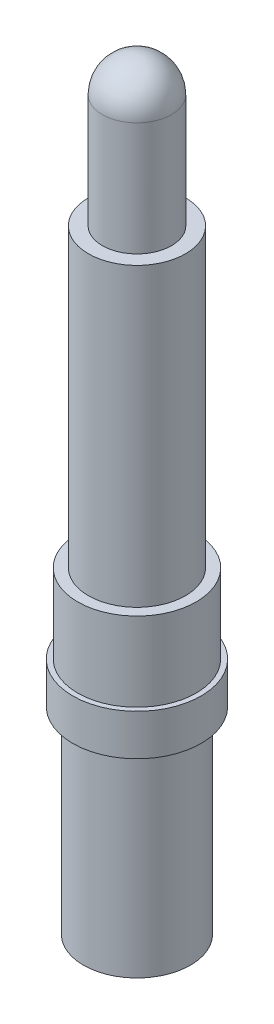
ISO-10303-21;
HEADER;
FILE_DESCRIPTION(('STEP AP214'),'2;1');
FILE_NAME('part.step','',(''),(''),'','','');
FILE_SCHEMA(('AUTOMOTIVE_DESIGN { 1 0 10303 214 1 1 1 1 }'));
ENDSEC;
DATA;
#1=APPLICATION_CONTEXT('core data for automotive mechanical design processes');
#2=APPLICATION_PROTOCOL_DEFINITION('international standard','automotive_design',2000,#1);
#3=PRODUCT_CONTEXT('',#1,'mechanical');
#4=PRODUCT('Part','Part','',(#3));
#5=PRODUCT_RELATED_PRODUCT_CATEGORY('part','',(#4));
#6=PRODUCT_DEFINITION_FORMATION('','',#4);
#7=PRODUCT_DEFINITION_CONTEXT('part definition',#1,'design');
#8=PRODUCT_DEFINITION('design','',#6,#7);
#9=PRODUCT_DEFINITION_SHAPE('','',#8);
#10=(LENGTH_UNIT() NAMED_UNIT(*) SI_UNIT(.MILLI.,.METRE.));
#11=(NAMED_UNIT(*) PLANE_ANGLE_UNIT() SI_UNIT($,.RADIAN.));
#12=(NAMED_UNIT(*) SI_UNIT($,.STERADIAN.) SOLID_ANGLE_UNIT());
#13=UNCERTAINTY_MEASURE_WITH_UNIT(LENGTH_MEASURE(1.E-05),#10,'distance_accuracy_value','');
#14=(GEOMETRIC_REPRESENTATION_CONTEXT(3) GLOBAL_UNCERTAINTY_ASSIGNED_CONTEXT((#13)) GLOBAL_UNIT_ASSIGNED_CONTEXT((#10,
#11,#12)) REPRESENTATION_CONTEXT('',''));
#15=CARTESIAN_POINT('',(0.,0.,0.));
#16=DIRECTION('',(0.,0.,1.));
#17=DIRECTION('',(1.,0.,0.));
#18=AXIS2_PLACEMENT_3D('',#15,#16,#17);
#19=CARTESIAN_POINT('',(0.,11.2268,0.));
#20=DIRECTION('',(0.,1.,0.));
#21=DIRECTION('',(1.,0.,0.));
#22=AXIS2_PLACEMENT_3D('',#19,#20,#21);
#23=SPHERICAL_SURFACE('',#22,0.533399999999996);
#24=CARTESIAN_POINT('',(0.,11.2268,0.));
#25=DIRECTION('',(0.,1.,0.));
#26=DIRECTION('',(0.,0.,1.));
#27=AXIS2_PLACEMENT_3D('',#24,#25,#26);
#28=CIRCLE('',#27,0.5334);
#29=CARTESIAN_POINT('',(0.,11.2268,0.5334));
#30=VERTEX_POINT('',#29);
#31=EDGE_CURVE('E10',#30,#30,#28,.T.);
#32=ORIENTED_EDGE('',*,*,#31,.T.);
#33=EDGE_LOOP('',(#32));
#34=FACE_BOUND('',#33,.T.);
#35=ADVANCED_FACE('F32',(#34),#23,.T.);
#36=CARTESIAN_POINT('',(0.,0.,0.));
#37=DIRECTION('',(0.,1.,0.));
#38=DIRECTION('',(0.,0.,1.));
#39=AXIS2_PLACEMENT_3D('',#36,#37,#38);
#40=CYLINDRICAL_SURFACE('',#39,0.5334);
#41=ORIENTED_EDGE('',*,*,#31,.F.);
#42=EDGE_LOOP('',(#41));
#43=FACE_BOUND('',#42,.T.);
#44=CARTESIAN_POINT('',(0.,9.4742,0.));
#45=DIRECTION('',(0.,1.,0.));
#46=DIRECTION('',(0.,0.,1.));
#47=AXIS2_PLACEMENT_3D('',#44,#45,#46);
#48=CIRCLE('',#47,0.5334);
#49=CARTESIAN_POINT('',(0.,9.4742,0.5334));
#50=VERTEX_POINT('',#49);
#51=EDGE_CURVE('E38',#50,#50,#48,.T.);
#52=ORIENTED_EDGE('',*,*,#51,.T.);
#53=EDGE_LOOP('',(#52));
#54=FACE_BOUND('',#53,.T.);
#55=ADVANCED_FACE('F82',(#43,#54),#40,.T.);
#56=CARTESIAN_POINT('',(0.5334,9.4742,0.));
#57=DIRECTION('',(0.,-1.,0.));
#58=DIRECTION('',(0.,0.,-1.));
#59=AXIS2_PLACEMENT_3D('',#56,#57,#58);
#60=PLANE('',#59);
#61=ORIENTED_EDGE('',*,*,#51,.F.);
#62=EDGE_LOOP('',(#61));
#63=FACE_BOUND('',#62,.T.);
#64=CARTESIAN_POINT('',(0.,9.4742,0.));
#65=DIRECTION('',(0.,1.,0.));
#66=DIRECTION('',(0.,0.,1.));
#67=AXIS2_PLACEMENT_3D('',#64,#65,#66);
#68=CIRCLE('',#67,0.7493);
#69=CARTESIAN_POINT('',(0.,9.4742,0.7493));
#70=VERTEX_POINT('',#69);
#71=EDGE_CURVE('E42',#70,#70,#68,.T.);
#72=ORIENTED_EDGE('',*,*,#71,.T.);
#73=EDGE_LOOP('',(#72));
#74=FACE_BOUND('',#73,.T.);
#75=ADVANCED_FACE('F86',(#63,#74),#60,.F.);
#76=CARTESIAN_POINT('',(0.,0.,0.));
#77=DIRECTION('',(0.,1.,0.));
#78=DIRECTION('',(0.,0.,1.));
#79=AXIS2_PLACEMENT_3D('',#76,#77,#78);
#80=CYLINDRICAL_SURFACE('',#79,0.749299999999999);
#81=ORIENTED_EDGE('',*,*,#71,.F.);
#82=EDGE_LOOP('',(#81));
#83=FACE_BOUND('',#82,.T.);
#84=CARTESIAN_POINT('',(0.,4.9022,0.));
#85=DIRECTION('',(0.,1.,0.));
#86=DIRECTION('',(0.,0.,1.));
#87=AXIS2_PLACEMENT_3D('',#84,#85,#86);
#88=CIRCLE('',#87,0.749299999999999);
#89=CARTESIAN_POINT('',(0.,4.9022,0.749299999999999));
#90=VERTEX_POINT('',#89);
#91=EDGE_CURVE('E46',#90,#90,#88,.T.);
#92=ORIENTED_EDGE('',*,*,#91,.T.);
#93=EDGE_LOOP('',(#92));
#94=FACE_BOUND('',#93,.T.);
#95=ADVANCED_FACE('F91',(#83,#94),#80,.T.);
#96=CARTESIAN_POINT('',(0.749299999999999,4.9022,0.));
#97=DIRECTION('',(0.,-1.,0.));
#98=DIRECTION('',(0.,0.,-1.));
#99=AXIS2_PLACEMENT_3D('',#96,#97,#98);
#100=PLANE('',#99);
#101=ORIENTED_EDGE('',*,*,#91,.F.);
#102=EDGE_LOOP('',(#101));
#103=FACE_BOUND('',#102,.T.);
#104=CARTESIAN_POINT('',(0.,4.9022,0.));
#105=DIRECTION('',(0.,1.,0.));
#106=DIRECTION('',(0.,0.,1.));
#107=AXIS2_PLACEMENT_3D('',#104,#105,#106);
#108=CIRCLE('',#107,0.914399999999999);
#109=CARTESIAN_POINT('',(0.,4.9022,0.914399999999999));
#110=VERTEX_POINT('',#109);
#111=EDGE_CURVE('E51',#110,#110,#108,.T.);
#112=ORIENTED_EDGE('',*,*,#111,.T.);
#113=EDGE_LOOP('',(#112));
#114=FACE_BOUND('',#113,.T.);
#115=ADVANCED_FACE('F97',(#103,#114),#100,.F.);
#116=CARTESIAN_POINT('',(0.,0.,0.));
#117=DIRECTION('',(0.,1.,0.));
#118=DIRECTION('',(0.,0.,1.));
#119=AXIS2_PLACEMENT_3D('',#116,#117,#118);
#120=CYLINDRICAL_SURFACE('',#119,0.9144);
#121=ORIENTED_EDGE('',*,*,#111,.F.);
#122=EDGE_LOOP('',(#121));
#123=FACE_BOUND('',#122,.T.);
#124=CARTESIAN_POINT('',(0.,3.683,0.));
#125=DIRECTION('',(0.,1.,0.));
#126=DIRECTION('',(0.,0.,1.));
#127=AXIS2_PLACEMENT_3D('',#124,#125,#126);
#128=CIRCLE('',#127,0.9144);
#129=CARTESIAN_POINT('',(0.,3.683,0.9144));
#130=VERTEX_POINT('',#129);
#131=EDGE_CURVE('E54',#130,#130,#128,.T.);
#132=ORIENTED_EDGE('',*,*,#131,.T.);
#133=EDGE_LOOP('',(#132));
#134=FACE_BOUND('',#133,.T.);
#135=ADVANCED_FACE('F101',(#123,#134),#120,.T.);
#136=CARTESIAN_POINT('',(0.9144,3.683,0.));
#137=DIRECTION('',(0.,-1.,0.));
#138=DIRECTION('',(0.,0.,-1.));
#139=AXIS2_PLACEMENT_3D('',#136,#137,#138);
#140=PLANE('',#139);
#141=ORIENTED_EDGE('',*,*,#131,.F.);
#142=EDGE_LOOP('',(#141));
#143=FACE_BOUND('',#142,.T.);
#144=CARTESIAN_POINT('',(0.,3.683,0.));
#145=DIRECTION('',(0.,1.,0.));
#146=DIRECTION('',(0.,0.,1.));
#147=AXIS2_PLACEMENT_3D('',#144,#145,#146);
#148=CIRCLE('',#147,0.9906);
#149=CARTESIAN_POINT('',(0.,3.683,0.9906));
#150=VERTEX_POINT('',#149);
#151=EDGE_CURVE('E57',#150,#150,#148,.T.);
#152=ORIENTED_EDGE('',*,*,#151,.T.);
#153=EDGE_LOOP('',(#152));
#154=FACE_BOUND('',#153,.T.);
#155=ADVANCED_FACE('F105',(#143,#154),#140,.F.);
#156=CARTESIAN_POINT('',(0.,0.,0.));
#157=DIRECTION('',(0.,1.,0.));
#158=DIRECTION('',(0.,0.,1.));
#159=AXIS2_PLACEMENT_3D('',#156,#157,#158);
#160=CYLINDRICAL_SURFACE('',#159,0.9906);
#161=ORIENTED_EDGE('',*,*,#151,.F.);
#162=EDGE_LOOP('',(#161));
#163=FACE_BOUND('',#162,.T.);
#164=CARTESIAN_POINT('',(0.,3.048,0.));
#165=DIRECTION('',(0.,1.,0.));
#166=DIRECTION('',(0.,0.,1.));
#167=AXIS2_PLACEMENT_3D('',#164,#165,#166);
#168=CIRCLE('',#167,0.9906);
#169=CARTESIAN_POINT('',(0.,3.048,0.9906));
#170=VERTEX_POINT('',#169);
#171=EDGE_CURVE('E60',#170,#170,#168,.T.);
#172=ORIENTED_EDGE('',*,*,#171,.T.);
#173=EDGE_LOOP('',(#172));
#174=FACE_BOUND('',#173,.T.);
#175=ADVANCED_FACE('F109',(#163,#174),#160,.T.);
#176=CARTESIAN_POINT('',(0.9906,3.048,0.));
#177=DIRECTION('',(0.,1.,0.));
#178=DIRECTION('',(0.,0.,1.));
#179=AXIS2_PLACEMENT_3D('',#176,#177,#178);
#180=PLANE('',#179);
#181=ORIENTED_EDGE('',*,*,#171,.F.);
#182=EDGE_LOOP('',(#181));
#183=FACE_BOUND('',#182,.T.);
#184=CARTESIAN_POINT('',(0.,3.048,0.));
#185=DIRECTION('',(0.,1.,0.));
#186=DIRECTION('',(0.,0.,1.));
#187=AXIS2_PLACEMENT_3D('',#184,#185,#186);
#188=CIRCLE('',#187,0.8255);
#189=CARTESIAN_POINT('',(0.,3.048,0.8255));
#190=VERTEX_POINT('',#189);
#191=EDGE_CURVE('E63',#190,#190,#188,.T.);
#192=ORIENTED_EDGE('',*,*,#191,.T.);
#193=EDGE_LOOP('',(#192));
#194=FACE_BOUND('',#193,.T.);
#195=ADVANCED_FACE('F78',(#183,#194),#180,.F.);
#196=CARTESIAN_POINT('',(0.,0.,0.));
#197=DIRECTION('',(0.,1.,0.));
#198=DIRECTION('',(0.,0.,1.));
#199=AXIS2_PLACEMENT_3D('',#196,#197,#198);
#200=CYLINDRICAL_SURFACE('',#199,0.8255);
#201=ORIENTED_EDGE('',*,*,#191,.F.);
#202=EDGE_LOOP('',(#201));
#203=FACE_BOUND('',#202,.T.);
#204=CARTESIAN_POINT('',(0.,0.,0.));
#205=DIRECTION('',(0.,1.,0.));
#206=DIRECTION('',(0.,0.,1.));
#207=AXIS2_PLACEMENT_3D('',#204,#205,#206);
#208=CIRCLE('',#207,0.8255);
#209=CARTESIAN_POINT('',(0.,0.,0.8255));
#210=VERTEX_POINT('',#209);
#211=EDGE_CURVE('E66',#210,#210,#208,.T.);
#212=ORIENTED_EDGE('',*,*,#211,.T.);
#213=EDGE_LOOP('',(#212));
#214=FACE_BOUND('',#213,.T.);
#215=ADVANCED_FACE('F70',(#203,#214),#200,.T.);
#216=CARTESIAN_POINT('',(0.8255,0.,0.));
#217=DIRECTION('',(0.,1.,0.));
#218=DIRECTION('',(0.,0.,1.));
#219=AXIS2_PLACEMENT_3D('',#216,#217,#218);
#220=PLANE('',#219);
#221=ORIENTED_EDGE('',*,*,#211,.F.);
#222=EDGE_LOOP('',(#221));
#223=FACE_BOUND('',#222,.T.);
#224=ADVANCED_FACE('F72',(#223),#220,.F.);
#225=CLOSED_SHELL('',(#35,#55,#75,#95,#115,#135,#155,#175,#195,#215,#224));
#226=MANIFOLD_SOLID_BREP('B2',#225);
#227=ADVANCED_BREP_SHAPE_REPRESENTATION('',(#18,#226),#14);
#228=SHAPE_DEFINITION_REPRESENTATION(#9,#227);
ENDSEC;
END-ISO-10303-21;
